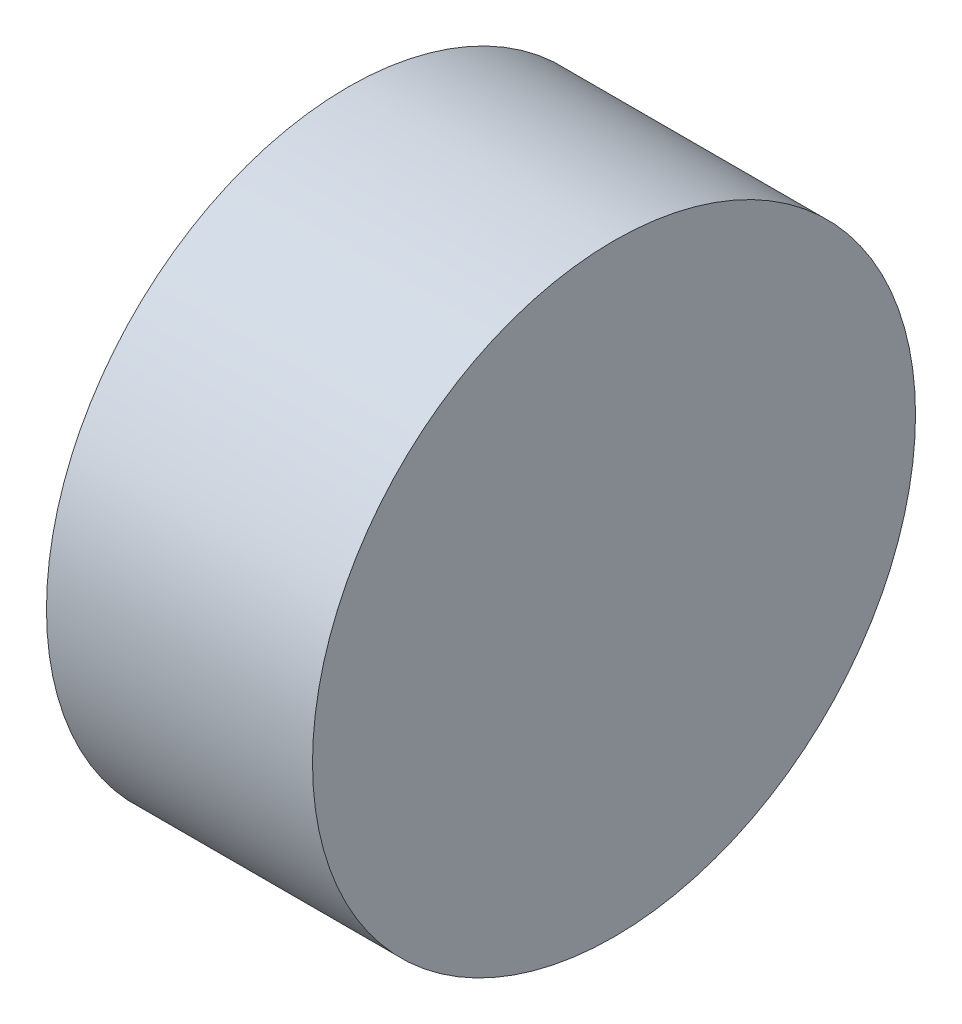
ISO-10303-21;
HEADER;
FILE_DESCRIPTION(('STEP AP214'),'2;1');
FILE_NAME('part.step','',(''),(''),'','','');
FILE_SCHEMA(('AUTOMOTIVE_DESIGN { 1 0 10303 214 1 1 1 1 }'));
ENDSEC;
DATA;
#1=APPLICATION_CONTEXT('core data for automotive mechanical design processes');
#2=APPLICATION_PROTOCOL_DEFINITION('international standard','automotive_design',2000,#1);
#3=PRODUCT_CONTEXT('',#1,'mechanical');
#4=PRODUCT('Part','Part','',(#3));
#5=PRODUCT_RELATED_PRODUCT_CATEGORY('part','',(#4));
#6=PRODUCT_DEFINITION_FORMATION('','',#4);
#7=PRODUCT_DEFINITION_CONTEXT('part definition',#1,'design');
#8=PRODUCT_DEFINITION('design','',#6,#7);
#9=PRODUCT_DEFINITION_SHAPE('','',#8);
#10=(LENGTH_UNIT() NAMED_UNIT(*) SI_UNIT(.MILLI.,.METRE.));
#11=(NAMED_UNIT(*) PLANE_ANGLE_UNIT() SI_UNIT($,.RADIAN.));
#12=(NAMED_UNIT(*) SI_UNIT($,.STERADIAN.) SOLID_ANGLE_UNIT());
#13=UNCERTAINTY_MEASURE_WITH_UNIT(LENGTH_MEASURE(1.E-05),#10,'distance_accuracy_value','');
#14=(GEOMETRIC_REPRESENTATION_CONTEXT(3) GLOBAL_UNCERTAINTY_ASSIGNED_CONTEXT((#13)) GLOBAL_UNIT_ASSIGNED_CONTEXT((#10,
#11,#12)) REPRESENTATION_CONTEXT('',''));
#15=CARTESIAN_POINT('',(0.,0.,0.));
#16=DIRECTION('',(0.,0.,1.));
#17=DIRECTION('',(1.,0.,0.));
#18=AXIS2_PLACEMENT_3D('',#15,#16,#17);
#19=CARTESIAN_POINT('',(1.400000245898,0.,0.749999871762));
#20=DIRECTION('',(0.999999999999943,0.,-3.37174793640881E-07));
#21=DIRECTION('',(-3.37174793640881E-07,0.,-0.999999999999943));
#22=AXIS2_PLACEMENT_3D('',#19,#20,#21);
#23=PLANE('',#22);
#24=CARTESIAN_POINT('',(1.40000024589814,0.,0.749999871762116));
#25=DIRECTION('',(0.999999999999943,0.,-3.37174793640881E-07));
#26=DIRECTION('',(-3.37174793640881E-07,0.,-0.999999999999943));
#27=AXIS2_PLACEMENT_3D('',#24,#25,#26);
#28=CIRCLE('',#27,0.680000007153);
#29=CARTESIAN_POINT('',(1.40000001661928,0.,0.0699998646091543));
#30=VERTEX_POINT('',#29);
#31=EDGE_CURVE('E18',#30,#30,#28,.F.);
#32=ORIENTED_EDGE('',*,*,#31,.F.);
#33=EDGE_LOOP('',(#32));
#34=FACE_BOUND('',#33,.T.);
#35=ADVANCED_FACE('F15',(#34),#23,.T.);
#36=CARTESIAN_POINT('',(0.800000222056,0.,0.750000074067));
#37=DIRECTION('',(0.999999999999943,0.,-3.37174793640881E-07));
#38=DIRECTION('',(-3.37174793640881E-07,0.,-0.999999999999943));
#39=AXIS2_PLACEMENT_3D('',#36,#37,#38);
#40=CYLINDRICAL_SURFACE('',#39,0.680000007153);
#41=ORIENTED_EDGE('',*,*,#31,.T.);
#42=EDGE_LOOP('',(#41));
#43=FACE_BOUND('',#42,.T.);
#44=CARTESIAN_POINT('',(0.800000222056138,0.,0.750000074067));
#45=DIRECTION('',(0.999999999999943,0.,-3.37174793640881E-07));
#46=DIRECTION('',(-3.37174793640881E-07,0.,-0.999999999999943));
#47=AXIS2_PLACEMENT_3D('',#44,#45,#46);
#48=CIRCLE('',#47,0.680000007153);
#49=CARTESIAN_POINT('',(0.799999992777276,0.,0.0700000669140385));
#50=VERTEX_POINT('',#49);
#51=EDGE_CURVE('E10',#50,#50,#48,.T.);
#52=ORIENTED_EDGE('',*,*,#51,.T.);
#53=EDGE_LOOP('',(#52));
#54=FACE_BOUND('',#53,.T.);
#55=ADVANCED_FACE('F27',(#43,#54),#40,.T.);
#56=CARTESIAN_POINT('',(0.800000222056,0.,0.750000074067));
#57=DIRECTION('',(0.999999999999943,0.,-3.37174793640881E-07));
#58=DIRECTION('',(-3.37174793640881E-07,0.,-0.999999999999943));
#59=AXIS2_PLACEMENT_3D('',#56,#57,#58);
#60=PLANE('',#59);
#61=ORIENTED_EDGE('',*,*,#51,.F.);
#62=EDGE_LOOP('',(#61));
#63=FACE_BOUND('',#62,.T.);
#64=ADVANCED_FACE('F34',(#63),#60,.F.);
#65=CLOSED_SHELL('',(#35,#55,#64));
#66=MANIFOLD_SOLID_BREP('B1',#65);
#67=ADVANCED_BREP_SHAPE_REPRESENTATION('',(#18,#66),#14);
#68=SHAPE_DEFINITION_REPRESENTATION(#9,#67);
ENDSEC;
END-ISO-10303-21;
